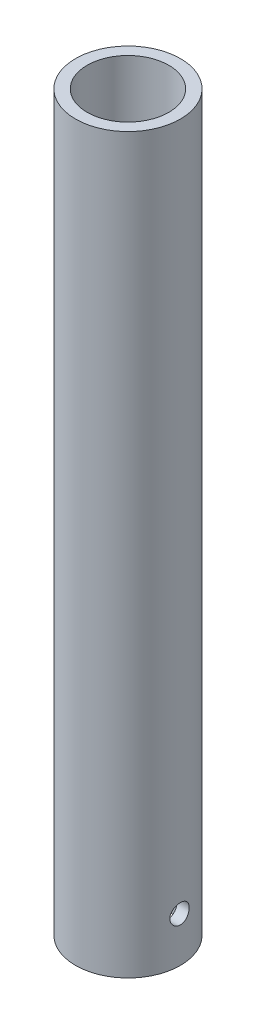
ISO-10303-21;
HEADER;
FILE_DESCRIPTION(('STEP AP214'),'2;1');
FILE_NAME('part.step','',(''),(''),'','','');
FILE_SCHEMA(('AUTOMOTIVE_DESIGN { 1 0 10303 214 1 1 1 1 }'));
ENDSEC;
DATA;
#1=APPLICATION_CONTEXT('core data for automotive mechanical design processes');
#2=APPLICATION_PROTOCOL_DEFINITION('international standard','automotive_design',2000,#1);
#3=PRODUCT_CONTEXT('',#1,'mechanical');
#4=PRODUCT('Part','Part','',(#3));
#5=PRODUCT_RELATED_PRODUCT_CATEGORY('part','',(#4));
#6=PRODUCT_DEFINITION_FORMATION('','',#4);
#7=PRODUCT_DEFINITION_CONTEXT('part definition',#1,'design');
#8=PRODUCT_DEFINITION('design','',#6,#7);
#9=PRODUCT_DEFINITION_SHAPE('','',#8);
#10=(LENGTH_UNIT() NAMED_UNIT(*) SI_UNIT(.MILLI.,.METRE.));
#11=(NAMED_UNIT(*) PLANE_ANGLE_UNIT() SI_UNIT($,.RADIAN.));
#12=(NAMED_UNIT(*) SI_UNIT($,.STERADIAN.) SOLID_ANGLE_UNIT());
#13=UNCERTAINTY_MEASURE_WITH_UNIT(LENGTH_MEASURE(1.E-05),#10,'distance_accuracy_value','');
#14=(GEOMETRIC_REPRESENTATION_CONTEXT(3) GLOBAL_UNCERTAINTY_ASSIGNED_CONTEXT((#13)) GLOBAL_UNIT_ASSIGNED_CONTEXT((#10,
#11,#12)) REPRESENTATION_CONTEXT('',''));
#15=CARTESIAN_POINT('',(0.,0.,0.));
#16=DIRECTION('',(0.,0.,1.));
#17=DIRECTION('',(1.,0.,0.));
#18=AXIS2_PLACEMENT_3D('',#15,#16,#17);
#19=CARTESIAN_POINT('',(0.,151.72,0.));
#20=DIRECTION('',(0.,1.,0.));
#21=DIRECTION('',(0.,0.,1.));
#22=AXIS2_PLACEMENT_3D('',#19,#20,#21);
#23=PLANE('',#22);
#24=CARTESIAN_POINT('',(0.,151.72,0.));
#25=DIRECTION('',(0.,1.,0.));
#26=DIRECTION('',(0.,0.,1.));
#27=AXIS2_PLACEMENT_3D('',#24,#25,#26);
#28=CIRCLE('',#27,10.85);
#29=CARTESIAN_POINT('',(0.,151.72,10.85));
#30=VERTEX_POINT('',#29);
#31=EDGE_CURVE('E10',#30,#30,#28,.T.);
#32=ORIENTED_EDGE('',*,*,#31,.T.);
#33=EDGE_LOOP('',(#32));
#34=FACE_BOUND('',#33,.T.);
#35=CARTESIAN_POINT('',(0.,151.72,0.));
#36=DIRECTION('',(0.,1.,0.));
#37=DIRECTION('',(0.,0.,1.));
#38=AXIS2_PLACEMENT_3D('',#35,#36,#37);
#39=CIRCLE('',#38,8.45);
#40=CARTESIAN_POINT('',(0.,151.72,8.45000000000001));
#41=VERTEX_POINT('',#40);
#42=EDGE_CURVE('E56',#41,#41,#39,.T.);
#43=ORIENTED_EDGE('',*,*,#42,.F.);
#44=EDGE_LOOP('',(#43));
#45=FACE_BOUND('',#44,.T.);
#46=ADVANCED_FACE('F34',(#34,#45),#23,.T.);
#47=CARTESIAN_POINT('',(0.,0.,0.));
#48=DIRECTION('',(0.,1.,0.));
#49=DIRECTION('',(0.,0.,1.));
#50=AXIS2_PLACEMENT_3D('',#47,#48,#49);
#51=PLANE('',#50);
#52=CARTESIAN_POINT('',(0.,0.,0.));
#53=DIRECTION('',(0.,1.,0.));
#54=DIRECTION('',(0.,0.,1.));
#55=AXIS2_PLACEMENT_3D('',#52,#53,#54);
#56=CIRCLE('',#55,10.85);
#57=CARTESIAN_POINT('',(0.,0.,10.85));
#58=VERTEX_POINT('',#57);
#59=EDGE_CURVE('E49',#58,#58,#56,.T.);
#60=ORIENTED_EDGE('',*,*,#59,.F.);
#61=EDGE_LOOP('',(#60));
#62=FACE_BOUND('',#61,.T.);
#63=CARTESIAN_POINT('',(0.,0.,0.));
#64=DIRECTION('',(0.,1.,0.));
#65=DIRECTION('',(0.,0.,1.));
#66=AXIS2_PLACEMENT_3D('',#63,#64,#65);
#67=CIRCLE('',#66,8.45);
#68=CARTESIAN_POINT('',(0.,0.,8.45000000000001));
#69=VERTEX_POINT('',#68);
#70=EDGE_CURVE('E59',#69,#69,#67,.T.);
#71=ORIENTED_EDGE('',*,*,#70,.T.);
#72=EDGE_LOOP('',(#71));
#73=FACE_BOUND('',#72,.T.);
#74=ADVANCED_FACE('F107',(#62,#73),#51,.F.);
#75=CARTESIAN_POINT('',(0.,151.72,0.));
#76=DIRECTION('',(0.,-1.,0.));
#77=DIRECTION('',(0.,0.,-1.));
#78=AXIS2_PLACEMENT_3D('',#75,#76,#77);
#79=CYLINDRICAL_SURFACE('',#78,10.85);
#80=CARTESIAN_POINT('',(-10.85,7.28,0.));
#81=CARTESIAN_POINT('',(-10.8499979966071,7.28000429014087,-0.111330237713952));
#82=CARTESIAN_POINT('',(-10.8482687684691,7.28932722775694,-0.222716692131425));
#83=CARTESIAN_POINT('',(-10.8415371818967,7.32634999873524,-0.442353143926067));
#84=CARTESIAN_POINT('',(-10.8365320216364,7.35406556315027,-0.550600373563324));
#85=CARTESIAN_POINT('',(-10.8238087013378,7.42699804570453,-0.760749986293585));
#86=CARTESIAN_POINT('',(-10.8160929554907,7.47219939368932,-0.862657920740687));
#87=CARTESIAN_POINT('',(-10.7987919375578,7.57877667632433,-1.05743349851401));
#88=CARTESIAN_POINT('',(-10.7892068266765,7.64015121644033,-1.15030192032765));
#89=CARTESIAN_POINT('',(-10.7691015375464,7.77808816806742,-1.32544878280122));
#90=CARTESIAN_POINT('',(-10.7585726847434,7.85480164143422,-1.40760727134947));
#91=CARTESIAN_POINT('',(-10.7378312779173,8.02091385125031,-1.55796462694323));
#92=CARTESIAN_POINT('',(-10.7276187461989,8.11031347976395,-1.62616251148334));
#93=CARTESIAN_POINT('',(-10.7085820287061,8.30010424973388,-1.74715881380481));
#94=CARTESIAN_POINT('',(-10.6997690319392,8.40057406050495,-1.79983574863052));
#95=CARTESIAN_POINT('',(-10.6846511739608,8.60912676630362,-1.88751729577165));
#96=CARTESIAN_POINT('',(-10.6783461040323,8.71720902691893,-1.92252337877316));
#97=CARTESIAN_POINT('',(-10.6690451529181,8.93663692623263,-1.97348566315497));
#98=CARTESIAN_POINT('',(-10.6660130169985,9.04793248824615,-1.9896507324599));
#99=CARTESIAN_POINT('',(-10.6634918841773,9.27169427952972,-2.00312032403724));
#100=CARTESIAN_POINT('',(-10.6640025803047,9.38416040653228,-2.00042648035225));
#101=CARTESIAN_POINT('',(-10.6684763859111,9.60556117155544,-1.97642420049726));
#102=CARTESIAN_POINT('',(-10.6723955292482,9.71452252723479,-1.95535280967121));
#103=CARTESIAN_POINT('',(-10.6831756202849,9.92733656796934,-1.89556667770517));
#104=CARTESIAN_POINT('',(-10.6900366891857,10.0311890423529,-1.85685120966242));
#105=CARTESIAN_POINT('',(-10.7059737673408,10.2315334653828,-1.76264274454816));
#106=CARTESIAN_POINT('',(-10.7150624107143,10.3279791560833,-1.70705360047875));
#107=CARTESIAN_POINT('',(-10.7344221587479,10.5102632127887,-1.58074379430912));
#108=CARTESIAN_POINT('',(-10.7446933794751,10.5961005358905,-1.51002164635492));
#109=CARTESIAN_POINT('',(-10.7654528075315,10.7561012499102,-1.35417317758374));
#110=CARTESIAN_POINT('',(-10.7759419380373,10.8300670723905,-1.26884400183011));
#111=CARTESIAN_POINT('',(-10.7958115245288,10.9626635761441,-1.08688360424585));
#112=CARTESIAN_POINT('',(-10.8051919700933,11.021294113279,-0.990252276196974));
#113=CARTESIAN_POINT('',(-10.8218052515382,11.1215830620547,-0.788227737721937));
#114=CARTESIAN_POINT('',(-10.8290355470758,11.1632214193481,-0.682824349956138));
#115=CARTESIAN_POINT('',(-10.8405141340358,11.2281469234557,-0.466356498469206));
#116=CARTESIAN_POINT('',(-10.8447627314514,11.2514359533775,-0.355292616904524));
#117=CARTESIAN_POINT('',(-10.8497573305719,11.2787278611626,-0.132356716032608));
#118=CARTESIAN_POINT('',(-10.8505525054138,11.283001519781,-0.0205189113177543));
#119=CARTESIAN_POINT('',(-10.8486863128133,11.2728670078927,0.202273442612423));
#120=CARTESIAN_POINT('',(-10.8460251092791,11.2584597232735,0.313228033460461));
#121=CARTESIAN_POINT('',(-10.8375757659389,11.2115974440297,0.530249067257712));
#122=CARTESIAN_POINT('',(-10.8318112930997,11.1792789939608,0.636345996498348));
#123=CARTESIAN_POINT('',(-10.8177990847865,11.0976591964105,0.841615602883251));
#124=CARTESIAN_POINT('',(-10.8095511851572,11.048356726248,0.940787821767655));
#125=CARTESIAN_POINT('',(-10.7913643850829,10.9335657740999,1.13055178694633));
#126=CARTESIAN_POINT('',(-10.7814084853757,10.8679112461564,1.22104142746274));
#127=CARTESIAN_POINT('',(-10.7609549762798,10.7225051456851,1.38981599730002));
#128=CARTESIAN_POINT('',(-10.7504573181786,10.6427523039301,1.46809982657467));
#129=CARTESIAN_POINT('',(-10.7299409616594,10.4701893447284,1.61126551848187));
#130=CARTESIAN_POINT('',(-10.719930120532,10.3772250626048,1.67596287248975));
#131=CARTESIAN_POINT('',(-10.7016771310991,10.1815888937768,1.78882323460131));
#132=CARTESIAN_POINT('',(-10.6934349184528,10.0789173604082,1.83698684422423));
#133=CARTESIAN_POINT('',(-10.6797136401145,9.86725711588392,1.91514863110321));
#134=CARTESIAN_POINT('',(-10.674221556278,9.75830094297544,1.94523252958497));
#135=CARTESIAN_POINT('',(-10.6665921476973,9.53677015146575,1.98664621813523));
#136=CARTESIAN_POINT('',(-10.6644544585646,9.42419592724999,1.9979780452515));
#137=CARTESIAN_POINT('',(-10.6637939232693,9.20047180962164,2.0014995484008));
#138=CARTESIAN_POINT('',(-10.6652161357828,9.08932655325165,1.99398015963117));
#139=CARTESIAN_POINT('',(-10.6713935554409,8.8699130223725,1.96064838329316));
#140=CARTESIAN_POINT('',(-10.676148744239,8.76164473203043,1.93483609641825));
#141=CARTESIAN_POINT('',(-10.6884335440639,8.55120798536769,1.86577223466991));
#142=CARTESIAN_POINT('',(-10.6959583037119,8.44902922367599,1.8225511418931));
#143=CARTESIAN_POINT('',(-10.7129380077987,8.25332676747094,1.71992803753564));
#144=CARTESIAN_POINT('',(-10.7223930822489,8.15980365655347,1.66052493596753));
#145=CARTESIAN_POINT('',(-10.742339199937,7.98260789325441,1.52620828726827));
#146=CARTESIAN_POINT('',(-10.7528432603442,7.89909746461232,1.4510826258397));
#147=CARTESIAN_POINT('',(-10.7736054181144,7.74577085518123,1.28789661602249));
#148=CARTESIAN_POINT('',(-10.7838634584008,7.67595782571319,1.1998332992356));
#149=CARTESIAN_POINT('',(-10.8030817768163,7.5514448304526,1.01235926139261));
#150=CARTESIAN_POINT('',(-10.8120300503164,7.4968809429623,0.912856898141448));
#151=CARTESIAN_POINT('',(-10.8275035155801,7.40533107782427,0.705965863966958));
#152=CARTESIAN_POINT('',(-10.8340310040783,7.36832842946854,0.598584784512844));
#153=CARTESIAN_POINT('',(-10.8425815787245,7.32054784332317,0.409059229963636));
#154=CARTESIAN_POINT('',(-10.8453479117638,7.30536812349246,0.328029311593736));
#155=CARTESIAN_POINT('',(-10.8490578415206,7.28509273600717,0.164676495206279));
#156=CARTESIAN_POINT('',(-10.8500014819575,7.27999682648063,0.0823536282493427));
#157=CARTESIAN_POINT('',(-10.85,7.28,0.));
#158=B_SPLINE_CURVE_WITH_KNOTS('',3,(#80,#81,#82,#83,#84,#85,#86,#87,#88,#89,#90,#91,#92,#93,
#94,#95,#96,#97,#98,#99,#100,#101,#102,#103,#104,#105,#106,#107,#108,#109,#110,#111,#112,#113,
#114,#115,#116,#117,#118,#119,#120,#121,#122,#123,#124,#125,#126,#127,#128,#129,#130,#131,#132,
#133,#134,#135,#136,#137,#138,#139,#140,#141,#142,#143,#144,#145,#146,#147,#148,#149,#150,#151,
#152,#153,#154,#155,#156,#157),.UNSPECIFIED.,.T.,.F.,(4,2,2,2,2,2,2,2,2,2,2,2,2,2,2,2,2,2,2,2,2,
2,2,2,2,2,2,2,2,2,2,2,2,2,2,2,2,2,4),(0.,0.333689564424345,0.667664899081648,1.00134352858348,
1.33499339603946,1.67210713695817,2.00924459477941,2.34895471397931,2.68863655557506,
3.02451581250134,3.36036596731428,3.69194713052482,4.02354195549024,4.35706286786356,
4.69061654246687,5.02924707002373,5.36788078030459,5.70691300176442,6.04591042536303,
6.380064716216,6.7142031613874,7.04582868350225,7.37747613099867,7.71263934498716,
8.04783274805276,8.38731961662486,8.72679413291139,9.06464613510149,9.4024614338339,
9.73509534408175,10.0677274233564,10.3997795921117,10.7318541327635,11.0687365858295,
11.4056964538156,11.7455736407525,12.0851275371212,12.3319715759047,12.5788096937743),.UNSPECIFIED.);
#159=CARTESIAN_POINT('',(-10.85,7.28,0.));
#160=VERTEX_POINT('',#159);
#161=EDGE_CURVE('E70',#160,#160,#158,.T.);
#162=ORIENTED_EDGE('',*,*,#161,.T.);
#163=EDGE_LOOP('',(#162));
#164=FACE_BOUND('',#163,.T.);
#165=CARTESIAN_POINT('',(10.6640752060364,9.28,-2.));
#166=CARTESIAN_POINT('',(10.6640773417752,9.16868787514926,-1.99999569531784));
#167=CARTESIAN_POINT('',(10.665836947721,9.05731949246498,-1.99067568851819));
#168=CARTESIAN_POINT('',(10.6726768633707,8.83772057026204,-1.95366561398047));
#169=CARTESIAN_POINT('',(10.6777600290373,8.72949281312049,-1.92595974681288));
#170=CARTESIAN_POINT('',(10.6906522398257,8.51938442741907,-1.85305561764876));
#171=CARTESIAN_POINT('',(10.6984587868341,8.41749808257137,-1.80787338232444));
#172=CARTESIAN_POINT('',(10.7159152036384,8.22275886184813,-1.70134114518312));
#173=CARTESIAN_POINT('',(10.7255649195179,8.1299052326597,-1.63999249320279));
#174=CARTESIAN_POINT('',(10.7457500863752,7.95474242402274,-1.50208201031393));
#175=CARTESIAN_POINT('',(10.7562939643004,7.87255770598945,-1.42536330848895));
#176=CARTESIAN_POINT('',(10.7770049305802,7.72214951055077,-1.2592295300043));
#177=CARTESIAN_POINT('',(10.7871719945587,7.65392693506837,-1.169813633766));
#178=CARTESIAN_POINT('',(10.806073889764,7.5329041998815,-0.980007860750698));
#179=CARTESIAN_POINT('',(10.8147976377749,7.48022115375081,-0.879542112603816));
#180=CARTESIAN_POINT('',(10.8297357304101,7.39252719740455,-0.670998205646433));
#181=CARTESIAN_POINT('',(10.8359502744191,7.35751488299388,-0.562920652481895));
#182=CARTESIAN_POINT('',(10.845110231829,7.30654047649984,-0.343510249680942));
#183=CARTESIAN_POINT('',(10.848091607339,7.29036867038193,-0.232227647853362));
#184=CARTESIAN_POINT('',(10.8505731974728,7.27688111065475,-0.00849146087402199));
#185=CARTESIAN_POINT('',(10.8500736990098,7.2795638029516,0.103962027003799));
#186=CARTESIAN_POINT('',(10.8456779823696,7.3035478201319,0.325410336768626));
#187=CARTESIAN_POINT('',(10.8418229581966,7.32462335407748,0.434430548642655));
#188=CARTESIAN_POINT('',(10.8311954959982,7.38443794036158,0.647360136341491));
#189=CARTESIAN_POINT('',(10.824422954306,7.42317762035521,0.75126933041258));
#190=CARTESIAN_POINT('',(10.8086523586324,7.5174374246326,0.951684845124722));
#191=CARTESIAN_POINT('',(10.7996423244636,7.5730482493404,1.04814752617146));
#192=CARTESIAN_POINT('',(10.7803939062936,7.69940498820727,1.23045649497745));
#193=CARTESIAN_POINT('',(10.7701554014519,7.77015239183696,1.31630173664592));
#194=CARTESIAN_POINT('',(10.7494057032939,7.92601957195865,1.47627621945631));
#195=CARTESIAN_POINT('',(10.7388927175699,8.01133685954928,1.55021291587639));
#196=CARTESIAN_POINT('',(10.7189242882562,8.19326282472387,1.68275620749519));
#197=CARTESIAN_POINT('',(10.7094688591346,8.28987165674679,1.74136259297961));
#198=CARTESIAN_POINT('',(10.6926837644054,8.49188851132399,1.841633796456));
#199=CARTESIAN_POINT('',(10.685357518873,8.59731034418757,1.88327140042991));
#200=CARTESIAN_POINT('',(10.673713269024,8.8138185155179,1.94818982261539));
#201=CARTESIAN_POINT('',(10.6693949361473,8.92490423388424,1.97147264579244));
#202=CARTESIAN_POINT('',(10.6643202357465,9.14785274706237,1.99874106810896));
#203=CARTESIAN_POINT('',(10.6635128748566,9.25968062374077,2.00300295157365));
#204=CARTESIAN_POINT('',(10.6654151744064,9.48245035748341,1.99284843527475));
#205=CARTESIAN_POINT('',(10.6681246670553,9.59339225656399,1.9784329266186));
#206=CARTESIAN_POINT('',(10.6767079434368,9.81033740565611,1.93156975949761));
#207=CARTESIAN_POINT('',(10.682556417516,9.91637288859206,1.89926626690185));
#208=CARTESIAN_POINT('',(10.6967369672058,10.1215261662516,1.81769679237324));
#209=CARTESIAN_POINT('',(10.7050692204888,10.2206434654703,1.76842959693611));
#210=CARTESIAN_POINT('',(10.7233949944004,10.4103659491921,1.65369277480466));
#211=CARTESIAN_POINT('',(10.7334060415588,10.5008636154974,1.5880482138445));
#212=CARTESIAN_POINT('',(10.753911803458,10.6696589700985,1.44265662669073));
#213=CARTESIAN_POINT('',(10.7644065601063,10.7479555987389,1.36290837687984));
#214=CARTESIAN_POINT('',(10.7848607052763,10.8911547966768,1.19034076567754));
#215=CARTESIAN_POINT('',(10.7948114539572,10.9558717988218,1.09736623334003));
#216=CARTESIAN_POINT('',(10.8129121459133,11.0687665897777,0.901703759523863));
#217=CARTESIAN_POINT('',(10.8210621568648,11.1169450001893,0.799016183293741));
#218=CARTESIAN_POINT('',(10.8346058693642,11.1951154487046,0.587361375815963));
#219=CARTESIAN_POINT('',(10.8400135037274,11.2251995641832,0.478429082007584));
#220=CARTESIAN_POINT('',(10.8475225226592,11.2666217559607,0.256949124796693));
#221=CARTESIAN_POINT('',(10.8496242429413,11.2779617357208,0.144401829679868));
#222=CARTESIAN_POINT('',(10.8502782588794,11.2815093096107,-0.0793319422289314));
#223=CARTESIAN_POINT('',(10.848882610425,11.2739974970242,-0.190513915379013));
#224=CARTESIAN_POINT('',(10.8428065715778,11.2406680473902,-0.410002888572744));
#225=CARTESIAN_POINT('',(10.8381262104305,11.2148505733273,-0.518309914204625));
#226=CARTESIAN_POINT('',(10.8260062472774,11.1457592693193,-0.728832760754707));
#227=CARTESIAN_POINT('',(10.8185712181185,11.1025143591608,-0.831058352497088));
#228=CARTESIAN_POINT('',(10.8017478422693,10.9998289708598,-1.02684469463771));
#229=CARTESIAN_POINT('',(10.7923593706313,10.9403874566615,-1.12040489021922));
#230=CARTESIAN_POINT('',(10.7725015912377,10.8060257023239,-1.29760535049923));
#231=CARTESIAN_POINT('',(10.7620191030939,10.7309022863825,-1.38109009837913));
#232=CARTESIAN_POINT('',(10.7412391644425,10.5677317003167,-1.53436593580373));
#233=CARTESIAN_POINT('',(10.7309417579826,10.4796814982746,-1.60415380381077));
#234=CARTESIAN_POINT('',(10.7115979991458,10.2922207929647,-1.72863621190333));
#235=CARTESIAN_POINT('',(10.7025635876253,10.1927162201729,-1.78319099805419));
#236=CARTESIAN_POINT('',(10.6869119382448,9.98582118904439,-1.87472325617031));
#237=CARTESIAN_POINT('',(10.6802923987436,9.87843835745927,-1.91171747549057));
#238=CARTESIAN_POINT('',(10.671614371372,9.68893463955589,-1.9594770125));
#239=CARTESIAN_POINT('',(10.6688038001562,9.60792970522735,-1.97464735940576));
#240=CARTESIAN_POINT('',(10.6650334513778,9.44462675021936,-1.99491031598051));
#241=CARTESIAN_POINT('',(10.6640736263996,9.36232876272211,-2.00000318383246));
#242=CARTESIAN_POINT('',(10.6640752060364,9.28,-2.));
#243=B_SPLINE_CURVE_WITH_KNOTS('',3,(#165,#166,#167,#168,#169,#170,#171,#172,#173,#174,#175,
#176,#177,#178,#179,#180,#181,#182,#183,#184,#185,#186,#187,#188,#189,#190,#191,#192,#193,#194,
#195,#196,#197,#198,#199,#200,#201,#202,#203,#204,#205,#206,#207,#208,#209,#210,#211,#212,#213,
#214,#215,#216,#217,#218,#219,#220,#221,#222,#223,#224,#225,#226,#227,#228,#229,#230,#231,#232,
#233,#234,#235,#236,#237,#238,#239,#240,#241,#242),.UNSPECIFIED.,.T.,.F.,(4,2,2,2,2,2,2,2,2,2,2,
2,2,2,2,2,2,2,2,2,2,2,2,2,2,2,2,2,2,2,2,2,2,2,2,2,2,2,4),(0.,0.333635127842299,
0.667557328592536,1.00117402983735,1.33476288412893,1.6719478761327,2.0091546426579,
2.34884138297385,2.68850112601571,3.02434285349316,3.36015689932973,3.69190556937845,
4.02366602827781,4.35724264725147,4.69085210596223,5.02940704168609,5.36796660850288,
5.7070670301597,6.0461304053983,6.38025241873202,6.71435849152932,7.04581026560321,
7.37728575512096,7.71246602353229,8.04767538601637,8.38720360878218,8.72671906902802,
9.06449187096214,9.40223037006695,9.7349718148099,10.0677102970215,10.3998988784876,
10.732108714211,11.0689244038656,11.4058192186577,11.7457102404282,12.0852764566692,
12.3320462587771,12.5788097386111),.UNSPECIFIED.);
#244=CARTESIAN_POINT('',(10.6640752060364,9.28,-2.));
#245=VERTEX_POINT('',#244);
#246=EDGE_CURVE('E166',#245,#245,#243,.T.);
#247=ORIENTED_EDGE('',*,*,#246,.T.);
#248=EDGE_LOOP('',(#247));
#249=FACE_BOUND('',#248,.T.);
#250=CARTESIAN_POINT('',(0.,11.28,-10.85));
#251=CARTESIAN_POINT('',(-0.111330237713948,11.2799957098591,-10.8499979966071));
#252=CARTESIAN_POINT('',(-0.222716692131422,11.2706727722431,-10.8482687684691));
#253=CARTESIAN_POINT('',(-0.442353143926063,11.2336500012648,-10.8415371818967));
#254=CARTESIAN_POINT('',(-0.550600373563317,11.2059344368497,-10.8365320216364));
#255=CARTESIAN_POINT('',(-0.760749986293581,11.1330019542955,-10.8238087013378));
#256=CARTESIAN_POINT('',(-0.862657920740688,11.0878006063107,-10.8160929554907));
#257=CARTESIAN_POINT('',(-1.05743349851401,10.9812233236757,-10.7987919375578));
#258=CARTESIAN_POINT('',(-1.15030192032765,10.9198487835597,-10.7892068266765));
#259=CARTESIAN_POINT('',(-1.32544878280121,10.7819118319326,-10.7691015375464));
#260=CARTESIAN_POINT('',(-1.40760727134947,10.7051983585658,-10.7585726847434));
#261=CARTESIAN_POINT('',(-1.55796462694323,10.5390861487497,-10.7378312779173));
#262=CARTESIAN_POINT('',(-1.62616251148334,10.4496865202361,-10.7276187461989));
#263=CARTESIAN_POINT('',(-1.7471588138048,10.2598957502661,-10.7085820287061));
#264=CARTESIAN_POINT('',(-1.79983574863052,10.159425939495,-10.6997690319392));
#265=CARTESIAN_POINT('',(-1.88751729577165,9.95087323369638,-10.6846511739608));
#266=CARTESIAN_POINT('',(-1.92252337877315,9.84279097308107,-10.6783461040323));
#267=CARTESIAN_POINT('',(-1.97348566315496,9.62336307376737,-10.6690451529181));
#268=CARTESIAN_POINT('',(-1.9896507324599,9.51206751175385,-10.6660130169985));
#269=CARTESIAN_POINT('',(-2.00312032403724,9.28830572047028,-10.6634918841773));
#270=CARTESIAN_POINT('',(-2.00042648035225,9.17583959346772,-10.6640025803047));
#271=CARTESIAN_POINT('',(-1.97642420049726,8.95443882844456,-10.6684763859111));
#272=CARTESIAN_POINT('',(-1.9553528096712,8.84547747276521,-10.6723955292482));
#273=CARTESIAN_POINT('',(-1.89556667770516,8.63266343203067,-10.6831756202849));
#274=CARTESIAN_POINT('',(-1.85685120966241,8.52881095764709,-10.6900366891857));
#275=CARTESIAN_POINT('',(-1.76264274454815,8.32846653461721,-10.7059737673408));
#276=CARTESIAN_POINT('',(-1.70705360047875,8.23202084391669,-10.7150624107143));
#277=CARTESIAN_POINT('',(-1.58074379430912,8.04973678721126,-10.7344221587479));
#278=CARTESIAN_POINT('',(-1.51002164635492,7.96389946410947,-10.7446933794751));
#279=CARTESIAN_POINT('',(-1.35417317758374,7.80389875008977,-10.7654528075315));
#280=CARTESIAN_POINT('',(-1.2688440018301,7.72993292760954,-10.7759419380373));
#281=CARTESIAN_POINT('',(-1.08688360424584,7.59733642385586,-10.7958115245288));
#282=CARTESIAN_POINT('',(-0.990252276196973,7.53870588672104,-10.8051919700933));
#283=CARTESIAN_POINT('',(-0.788227737721938,7.43841693794535,-10.8218052515382));
#284=CARTESIAN_POINT('',(-0.682824349956136,7.39677858065188,-10.8290355470758));
#285=CARTESIAN_POINT('',(-0.466356498469202,7.33185307654428,-10.8405141340358));
#286=CARTESIAN_POINT('',(-0.355292616904521,7.30856404662252,-10.8447627314514));
#287=CARTESIAN_POINT('',(-0.132356716032606,7.28127213883738,-10.8497573305719));
#288=CARTESIAN_POINT('',(-0.0205189113177515,7.27699848021903,-10.8505525054138));
#289=CARTESIAN_POINT('',(0.202273442612428,7.28713299210733,-10.8486863128133));
#290=CARTESIAN_POINT('',(0.313228033460468,7.30154027672649,-10.8460251092791));
#291=CARTESIAN_POINT('',(0.530249067257717,7.34840255597027,-10.8375757659389));
#292=CARTESIAN_POINT('',(0.63634599649835,7.38072100603917,-10.8318112930997));
#293=CARTESIAN_POINT('',(0.841615602883254,7.46234080358953,-10.8177990847866));
#294=CARTESIAN_POINT('',(0.940787821767662,7.51164327375195,-10.8095511851572));
#295=CARTESIAN_POINT('',(1.13055178694633,7.6264342259001,-10.7913643850829));
#296=CARTESIAN_POINT('',(1.22104142746273,7.69208875384356,-10.7814084853757));
#297=CARTESIAN_POINT('',(1.38981599730001,7.83749485431489,-10.7609549762798));
#298=CARTESIAN_POINT('',(1.46809982657467,7.91724769606985,-10.7504573181786));
#299=CARTESIAN_POINT('',(1.61126551848187,8.08981065527158,-10.7299409616594));
#300=CARTESIAN_POINT('',(1.67596287248975,8.18277493739516,-10.719930120532));
#301=CARTESIAN_POINT('',(1.78882323460131,8.37841110622323,-10.7016771310991));
#302=CARTESIAN_POINT('',(1.83698684422423,8.48108263959185,-10.6934349184528));
#303=CARTESIAN_POINT('',(1.91514863110321,8.69274288411608,-10.6797136401145));
#304=CARTESIAN_POINT('',(1.94523252958497,8.80169905702456,-10.674221556278));
#305=CARTESIAN_POINT('',(1.98664621813523,9.02322984853426,-10.6665921476973));
#306=CARTESIAN_POINT('',(1.9979780452515,9.13580407275001,-10.6644544585646));
#307=CARTESIAN_POINT('',(2.0014995484008,9.35952819037836,-10.6637939232693));
#308=CARTESIAN_POINT('',(1.99398015963117,9.47067344674835,-10.6652161357828));
#309=CARTESIAN_POINT('',(1.96064838329316,9.69008697762751,-10.6713935554409));
#310=CARTESIAN_POINT('',(1.93483609641825,9.79835526796957,-10.676148744239));
#311=CARTESIAN_POINT('',(1.86577223466991,10.0087920146323,-10.6884335440639));
#312=CARTESIAN_POINT('',(1.82255114189311,10.110970776324,-10.6959583037119));
#313=CARTESIAN_POINT('',(1.71992803753564,10.3066732325291,-10.7129380077987));
#314=CARTESIAN_POINT('',(1.66052493596754,10.4001963434465,-10.7223930822489));
#315=CARTESIAN_POINT('',(1.52620828726828,10.5773921067456,-10.742339199937));
#316=CARTESIAN_POINT('',(1.45108262583971,10.6609025353877,-10.7528432603442));
#317=CARTESIAN_POINT('',(1.2878966160225,10.8142291448188,-10.7736054181144));
#318=CARTESIAN_POINT('',(1.1998332992356,10.8840421742868,-10.7838634584008));
#319=CARTESIAN_POINT('',(1.01235926139262,11.0085551695474,-10.8030817768163));
#320=CARTESIAN_POINT('',(0.912856898141453,11.0631190570377,-10.8120300503164));
#321=CARTESIAN_POINT('',(0.705965863966965,11.1546689221757,-10.8275035155801));
#322=CARTESIAN_POINT('',(0.598584784512849,11.1916715705315,-10.8340310040783));
#323=CARTESIAN_POINT('',(0.409059229963639,11.2394521566768,-10.8425815787245));
#324=CARTESIAN_POINT('',(0.32802931159374,11.2546318765075,-10.8453479117638));
#325=CARTESIAN_POINT('',(0.164676495206283,11.2749072639928,-10.8490578415206));
#326=CARTESIAN_POINT('',(0.0823536282493466,11.2800031735194,-10.8500014819575));
#327=CARTESIAN_POINT('',(0.,11.28,-10.85));
#328=B_SPLINE_CURVE_WITH_KNOTS('',3,(#250,#251,#252,#253,#254,#255,#256,#257,#258,#259,#260,
#261,#262,#263,#264,#265,#266,#267,#268,#269,#270,#271,#272,#273,#274,#275,#276,#277,#278,#279,
#280,#281,#282,#283,#284,#285,#286,#287,#288,#289,#290,#291,#292,#293,#294,#295,#296,#297,#298,
#299,#300,#301,#302,#303,#304,#305,#306,#307,#308,#309,#310,#311,#312,#313,#314,#315,#316,#317,
#318,#319,#320,#321,#322,#323,#324,#325,#326,#327),.UNSPECIFIED.,.T.,.F.,(4,2,2,2,2,2,2,2,2,2,2,
2,2,2,2,2,2,2,2,2,2,2,2,2,2,2,2,2,2,2,2,2,2,2,2,2,2,2,4),(0.,0.333689564424345,
0.667664899081652,1.00134352858348,1.33499339603946,1.67210713695818,2.00924459477942,
2.34895471397931,2.68863655557506,3.02451581250134,3.36036596731428,3.69194713052482,
4.02354195549024,4.35706286786357,4.69061654246688,5.02924707002374,5.36788078030459,
5.70691300176442,6.04591042536302,6.380064716216,6.7142031613874,7.04582868350225,
7.37747613099867,7.71263934498715,8.04783274805276,8.38731961662485,8.72679413291138,
9.06464613510149,9.4024614338339,9.73509534408175,10.0677274233564,10.3997795921117,
10.7318541327635,11.0687365858295,11.4056964538156,11.7455736407525,12.0851275371212,
12.3319715759047,12.5788096937743),.UNSPECIFIED.);
#329=CARTESIAN_POINT('',(0.,11.28,-10.85));
#330=VERTEX_POINT('',#329);
#331=EDGE_CURVE('E69',#330,#330,#328,.T.);
#332=ORIENTED_EDGE('',*,*,#331,.T.);
#333=EDGE_LOOP('',(#332));
#334=FACE_BOUND('',#333,.T.);
#335=ORIENTED_EDGE('',*,*,#31,.F.);
#336=EDGE_LOOP('',(#335));
#337=FACE_BOUND('',#336,.T.);
#338=ORIENTED_EDGE('',*,*,#59,.T.);
#339=EDGE_LOOP('',(#338));
#340=FACE_BOUND('',#339,.T.);
#341=ADVANCED_FACE('F36',(#164,#249,#334,#337,#340),#79,.T.);
#342=CARTESIAN_POINT('',(0.,151.72,0.));
#343=DIRECTION('',(0.,-1.,0.));
#344=DIRECTION('',(0.,0.,-1.));
#345=AXIS2_PLACEMENT_3D('',#342,#343,#344);
#346=CYLINDRICAL_SURFACE('',#345,8.45);
#347=CARTESIAN_POINT('',(-8.20990255727801,9.28,-2.));
#348=CARTESIAN_POINT('',(-8.20990475552876,9.3906392686705,-1.99999654270131));
#349=CARTESIAN_POINT('',(-8.21216346976921,9.50131818668973,-1.99078795828261));
#350=CARTESIAN_POINT('',(-8.2209340954777,9.71951130914219,-1.95424745281454));
#351=CARTESIAN_POINT('',(-8.22744874475778,9.82702342983873,-1.92690386547743));
#352=CARTESIAN_POINT('',(-8.24395302470165,10.0356953597124,-1.85501678074259));
#353=CARTESIAN_POINT('',(-8.25393846661181,10.1368626532477,-1.81049400908132));
#354=CARTESIAN_POINT('',(-8.2762540934701,10.3302991312082,-1.70557395500154));
#355=CARTESIAN_POINT('',(-8.28858431368615,10.4225681817632,-1.64517643380502));
#356=CARTESIAN_POINT('',(-8.31447251620076,10.5974112559291,-1.50894863419256));
#357=CARTESIAN_POINT('',(-8.32804842616322,10.6797837990624,-1.43286312226816));
#358=CARTESIAN_POINT('',(-8.35474220892098,10.8307252032648,-1.26796945814503));
#359=CARTESIAN_POINT('',(-8.36786004211568,10.8992928733365,-1.17916020935293));
#360=CARTESIAN_POINT('',(-8.39235665911726,11.0214904724158,-0.989972602496738));
#361=CARTESIAN_POINT('',(-8.4037118186339,11.0749242832749,-0.889464247387046));
#362=CARTESIAN_POINT('',(-8.42320003020645,11.164065029396,-0.680579585902402));
#363=CARTESIAN_POINT('',(-8.43133350703418,11.1997743017568,-0.57220431899362));
#364=CARTESIAN_POINT('',(-8.4433352155671,11.2518120795093,-0.352760410083173));
#365=CARTESIAN_POINT('',(-8.44727854843723,11.2684822510737,-0.241776966646724));
#366=CARTESIAN_POINT('',(-8.45071670921209,11.2830392290785,-0.0185233875559222));
#367=CARTESIAN_POINT('',(-8.45021212921939,11.2809285356121,0.0937465748509437));
#368=CARTESIAN_POINT('',(-8.44486788094057,11.2582332898663,0.314022947885541));
#369=CARTESIAN_POINT('',(-8.4401147019018,11.2380172934474,0.422069742167662));
#370=CARTESIAN_POINT('',(-8.42690705371958,11.1802754511098,0.633191882982702));
#371=CARTESIAN_POINT('',(-8.41845239970871,11.1427487406154,0.736266980922459));
#372=CARTESIAN_POINT('',(-8.39865645384913,11.051140386438,0.935513705170813));
#373=CARTESIAN_POINT('',(-8.38729177126976,10.9969238403557,1.03162088765924));
#374=CARTESIAN_POINT('',(-8.36291454067668,10.8735763465834,1.21350461296647));
#375=CARTESIAN_POINT('',(-8.34990173309073,10.804443048363,1.29927952433846));
#376=CARTESIAN_POINT('',(-8.32327876587647,10.6512348731056,1.46025964173378));
#377=CARTESIAN_POINT('',(-8.30966177483238,10.5668376374688,1.53515722645916));
#378=CARTESIAN_POINT('',(-8.28365764841308,10.3865385294329,1.66979995324151));
#379=CARTESIAN_POINT('',(-8.27127055899037,10.2906362274682,1.72954452926995));
#380=CARTESIAN_POINT('',(-8.24910687683645,10.0894930666415,1.83235517841203));
#381=CARTESIAN_POINT('',(-8.23934081421249,9.98421673640873,1.87535427858571));
#382=CARTESIAN_POINT('',(-8.22366416635784,9.76764439706731,1.94295255044603));
#383=CARTESIAN_POINT('',(-8.21775285197594,9.6563495307204,1.96755520207221));
#384=CARTESIAN_POINT('',(-8.21060619884112,9.43373376882366,1.99716659497304));
#385=CARTESIAN_POINT('',(-8.20926306764168,9.32247635624226,2.00262711759685));
#386=CARTESIAN_POINT('',(-8.21111259868127,9.10064058688705,1.9950300749416));
#387=CARTESIAN_POINT('',(-8.21430489094246,8.99006217546261,1.98197402015522));
#388=CARTESIAN_POINT('',(-8.22476293719761,8.77435434593327,1.93810880258078));
#389=CARTESIAN_POINT('',(-8.2319697476439,8.66916959731486,1.90755635426513));
#390=CARTESIAN_POINT('',(-8.24959007190553,8.46541324509357,1.82984728028893));
#391=CARTESIAN_POINT('',(-8.26000393441957,8.36684236202794,1.78268884900093));
#392=CARTESIAN_POINT('',(-8.28309627694213,8.17717951448558,1.67213907230348));
#393=CARTESIAN_POINT('',(-8.29581173173946,8.08625169787724,1.608473998375));
#394=CARTESIAN_POINT('',(-8.32198090258961,7.91620416004907,1.46706952469958));
#395=CARTESIAN_POINT('',(-8.33543472663236,7.83708617239964,1.3893280623722));
#396=CARTESIAN_POINT('',(-8.36192566012557,7.69110795203079,1.21991684993756));
#397=CARTESIAN_POINT('',(-8.37494692311717,7.6245582865882,1.12797656973881));
#398=CARTESIAN_POINT('',(-8.39879483901961,7.50784595272677,0.933961184314762));
#399=CARTESIAN_POINT('',(-8.40962160230693,7.457682460057,0.831886589198763));
#400=CARTESIAN_POINT('',(-8.42779482934101,7.37557740203893,0.621182096530083));
#401=CARTESIAN_POINT('',(-8.4351651557949,7.34351057741099,0.512603162410048));
#402=CARTESIAN_POINT('',(-8.44569901204562,7.29812559961953,0.291402405068257));
#403=CARTESIAN_POINT('',(-8.4488632644506,7.28480422594381,0.178781279714721));
#404=CARTESIAN_POINT('',(-8.45060248324506,7.27745357453244,-0.0443762647573327));
#405=CARTESIAN_POINT('',(-8.44928702082578,7.28296370128216,-0.154896901670485));
#406=CARTESIAN_POINT('',(-8.44245396611759,7.31207557133977,-0.373389413104336));
#407=CARTESIAN_POINT('',(-8.43693647589609,7.33567687521242,-0.481361349467385));
#408=CARTESIAN_POINT('',(-8.42233244857856,7.40006518955059,-0.691264528620824));
#409=CARTESIAN_POINT('',(-8.41326159264742,7.44077674843229,-0.793220077807188));
#410=CARTESIAN_POINT('',(-8.39251167556695,7.53815984276251,-0.988909228092863));
#411=CARTESIAN_POINT('',(-8.38083231710483,7.59483319770242,-1.08264189026365));
#412=CARTESIAN_POINT('',(-8.35581306378754,7.72397874130253,-1.2614369508205));
#413=CARTESIAN_POINT('',(-8.34244250429426,7.79676858987874,-1.34626562079082));
#414=CARTESIAN_POINT('',(-8.31569716507395,7.9554534207161,-1.50266097763634));
#415=CARTESIAN_POINT('',(-8.30232238512103,8.04135163972934,-1.5742243793256));
#416=CARTESIAN_POINT('',(-8.27683766761389,8.22549554275692,-1.70319128701922));
#417=CARTESIAN_POINT('',(-8.26475182403847,8.32391923843477,-1.76034571494132));
#418=CARTESIAN_POINT('',(-8.24352741819897,8.52924638273883,-1.85721097842153));
#419=CARTESIAN_POINT('',(-8.23438655575116,8.63614313175291,-1.8969354365141));
#420=CARTESIAN_POINT('',(-8.2216326961836,8.832492423492,-1.95137298489481));
#421=CARTESIAN_POINT('',(-8.21726522280246,8.92094622009255,-1.96957054125578));
#422=CARTESIAN_POINT('',(-8.21139935376269,9.0995913016972,-1.99388505137517));
#423=CARTESIAN_POINT('',(-8.20990076477922,9.18978246921176,-2.00000281915232));
#424=CARTESIAN_POINT('',(-8.20990255727801,9.28,-2.));
#425=B_SPLINE_CURVE_WITH_KNOTS('',3,(#347,#348,#349,#350,#351,#352,#353,#354,#355,#356,#357,
#358,#359,#360,#361,#362,#363,#364,#365,#366,#367,#368,#369,#370,#371,#372,#373,#374,#375,#376,
#377,#378,#379,#380,#381,#382,#383,#384,#385,#386,#387,#388,#389,#390,#391,#392,#393,#394,#395,
#396,#397,#398,#399,#400,#401,#402,#403,#404,#405,#406,#407,#408,#409,#410,#411,#412,#413,#414,
#415,#416,#417,#418,#419,#420,#421,#422,#423,#424),.UNSPECIFIED.,.T.,.F.,(4,2,2,2,2,2,2,2,2,2,2,
2,2,2,2,2,2,2,2,2,2,2,2,2,2,2,2,2,2,2,2,2,2,2,2,2,2,2,4),(0.,0.331586805394917,
0.663387128490735,0.994788398172974,1.32619465287052,1.66349162589331,2.00081768631177,
2.34233362834736,2.68380452725107,3.01904621548658,3.35424327729389,3.68276828809476,
4.01130970870463,4.34257970726241,4.6739019443756,5.01327819436059,5.35266711960759,
5.69339981085515,6.03406803154258,6.36663977203837,6.69918438450293,7.02697039493995,
7.354792057724,7.68844273707593,8.02214234510738,8.3632384998256,8.70431749421357,
9.0430057466435,9.38163580453434,9.71204325953286,10.0424426891786,10.3714001857015,
10.7003951954052,11.0365667098591,11.3728213673521,11.714541847083,12.0559947745963,
12.3263956843474,12.5967783720149),.UNSPECIFIED.);
#426=CARTESIAN_POINT('',(-8.20990255727801,9.28,-2.));
#427=VERTEX_POINT('',#426);
#428=EDGE_CURVE('E39',#427,#427,#425,.T.);
#429=ORIENTED_EDGE('',*,*,#428,.F.);
#430=EDGE_LOOP('',(#429));
#431=FACE_BOUND('',#430,.T.);
#432=CARTESIAN_POINT('',(8.20990255727802,9.28,-2.));
#433=CARTESIAN_POINT('',(8.20990475552877,9.16936073132951,-1.99999654270131));
#434=CARTESIAN_POINT('',(8.21216346976922,9.05868181331028,-1.99078795828261));
#435=CARTESIAN_POINT('',(8.22093409547772,8.84048869085782,-1.95424745281454));
#436=CARTESIAN_POINT('',(8.22744874475779,8.73297657016127,-1.92690386547743));
#437=CARTESIAN_POINT('',(8.24395302470166,8.52430464028756,-1.85501678074259));
#438=CARTESIAN_POINT('',(8.25393846661182,8.4231373467523,-1.81049400908132));
#439=CARTESIAN_POINT('',(8.27625409347011,8.22970086879176,-1.70557395500154));
#440=CARTESIAN_POINT('',(8.28858431368616,8.1374318182368,-1.64517643380502));
#441=CARTESIAN_POINT('',(8.31447251620077,7.96258874407088,-1.50894863419256));
#442=CARTESIAN_POINT('',(8.32804842616324,7.88021620093757,-1.43286312226816));
#443=CARTESIAN_POINT('',(8.35474220892099,7.72927479673522,-1.26796945814503));
#444=CARTESIAN_POINT('',(8.36786004211569,7.66070712666346,-1.17916020935293));
#445=CARTESIAN_POINT('',(8.39235665911727,7.53850952758423,-0.989972602496739));
#446=CARTESIAN_POINT('',(8.40371181863392,7.48507571672506,-0.889464247387046));
#447=CARTESIAN_POINT('',(8.42320003020646,7.39593497060402,-0.680579585902403));
#448=CARTESIAN_POINT('',(8.43133350703419,7.36022569824317,-0.572204318993622));
#449=CARTESIAN_POINT('',(8.44333521556711,7.30818792049065,-0.352760410083176));
#450=CARTESIAN_POINT('',(8.44727854843725,7.2915177489263,-0.241776966646726));
#451=CARTESIAN_POINT('',(8.45071670921211,7.27696077092151,-0.0185233875559238));
#452=CARTESIAN_POINT('',(8.45021212921939,7.27907146438786,0.0937465748509421));
#453=CARTESIAN_POINT('',(8.44486788094057,7.3017667101337,0.314022947885538));
#454=CARTESIAN_POINT('',(8.44011470190181,7.32198270655263,0.422069742167658));
#455=CARTESIAN_POINT('',(8.42690705371959,7.37972454889022,0.633191882982698));
#456=CARTESIAN_POINT('',(8.41845239970871,7.41725125938462,0.736266980922457));
#457=CARTESIAN_POINT('',(8.39865645384913,7.50885961356196,0.935513705170813));
#458=CARTESIAN_POINT('',(8.38729177126978,7.56307615964426,1.03162088765924));
#459=CARTESIAN_POINT('',(8.36291454067669,7.68642365341663,1.21350461296647));
#460=CARTESIAN_POINT('',(8.34990173309074,7.75555695163703,1.29927952433846));
#461=CARTESIAN_POINT('',(8.32327876587648,7.90876512689444,1.46025964173378));
#462=CARTESIAN_POINT('',(8.3096617748324,7.99316236253123,1.53515722645916));
#463=CARTESIAN_POINT('',(8.28365764841309,8.17346147056715,1.66979995324151));
#464=CARTESIAN_POINT('',(8.27127055899038,8.2693637725318,1.72954452926996));
#465=CARTESIAN_POINT('',(8.24910687683646,8.47050693335853,1.83235517841204));
#466=CARTESIAN_POINT('',(8.23934081421251,8.57578326359127,1.87535427858571));
#467=CARTESIAN_POINT('',(8.22366416635785,8.79235560293269,1.94295255044602));
#468=CARTESIAN_POINT('',(8.21775285197595,8.9036504692796,1.96755520207221));
#469=CARTESIAN_POINT('',(8.21060619884113,9.12626623117633,1.99716659497304));
#470=CARTESIAN_POINT('',(8.20926306764169,9.23752364375774,2.00262711759685));
#471=CARTESIAN_POINT('',(8.21111259868128,9.45935941311295,1.9950300749416));
#472=CARTESIAN_POINT('',(8.21430489094247,9.56993782453739,1.98197402015522));
#473=CARTESIAN_POINT('',(8.22476293719762,9.78564565406673,1.93810880258078));
#474=CARTESIAN_POINT('',(8.23196974764391,9.89083040268514,1.90755635426513));
#475=CARTESIAN_POINT('',(8.24959007190554,10.0945867549064,1.82984728028893));
#476=CARTESIAN_POINT('',(8.26000393441957,10.1931576379721,1.78268884900093));
#477=CARTESIAN_POINT('',(8.28309627694214,10.3828204855144,1.67213907230348));
#478=CARTESIAN_POINT('',(8.29581173173947,10.4737483021228,1.60847399837501));
#479=CARTESIAN_POINT('',(8.32198090258962,10.6437958399509,1.46706952469958));
#480=CARTESIAN_POINT('',(8.33543472663236,10.7229138276004,1.38932806237219));
#481=CARTESIAN_POINT('',(8.36192566012557,10.8688920479692,1.21991684993756));
#482=CARTESIAN_POINT('',(8.37494692311719,10.9354417134118,1.12797656973881));
#483=CARTESIAN_POINT('',(8.39879483901963,11.0521540472732,0.933961184314767));
#484=CARTESIAN_POINT('',(8.40962160230694,11.102317539943,0.831886589198765));
#485=CARTESIAN_POINT('',(8.42779482934102,11.1844225979611,0.621182096530085));
#486=CARTESIAN_POINT('',(8.43516515579491,11.216489422589,0.512603162410052));
#487=CARTESIAN_POINT('',(8.44569901204563,11.2618744003805,0.291402405068262));
#488=CARTESIAN_POINT('',(8.4488632644506,11.2751957740562,0.178781279714725));
#489=CARTESIAN_POINT('',(8.45060248324507,11.2825464254676,-0.0443762647573319));
#490=CARTESIAN_POINT('',(8.4492870208258,11.2770362987178,-0.154896901670485));
#491=CARTESIAN_POINT('',(8.44245396611761,11.2479244286602,-0.373389413104337));
#492=CARTESIAN_POINT('',(8.43693647589609,11.2243231247876,-0.481361349467386));
#493=CARTESIAN_POINT('',(8.42233244857857,11.1599348104494,-0.691264528620826));
#494=CARTESIAN_POINT('',(8.41326159264743,11.1192232515677,-0.793220077807192));
#495=CARTESIAN_POINT('',(8.39251167556696,11.0218401572375,-0.988909228092866));
#496=CARTESIAN_POINT('',(8.38083231710484,10.9651668022976,-1.08264189026365));
#497=CARTESIAN_POINT('',(8.35581306378755,10.8360212586975,-1.2614369508205));
#498=CARTESIAN_POINT('',(8.34244250429427,10.7632314101213,-1.34626562079083));
#499=CARTESIAN_POINT('',(8.31569716507397,10.6045465792839,-1.50266097763634));
#500=CARTESIAN_POINT('',(8.30232238512104,10.5186483602707,-1.57422437932559));
#501=CARTESIAN_POINT('',(8.27683766761389,10.3345044572431,-1.70319128701922));
#502=CARTESIAN_POINT('',(8.26475182403848,10.2360807615652,-1.76034571494133));
#503=CARTESIAN_POINT('',(8.24352741819899,10.0307536172612,-1.85721097842154));
#504=CARTESIAN_POINT('',(8.23438655575117,9.92385686824709,-1.89693543651411));
#505=CARTESIAN_POINT('',(8.22163269618361,9.727507576508,-1.95137298489481));
#506=CARTESIAN_POINT('',(8.21726522280247,9.63905377990745,-1.96957054125578));
#507=CARTESIAN_POINT('',(8.2113993537627,9.46040869830281,-1.99388505137517));
#508=CARTESIAN_POINT('',(8.20990076477923,9.37021753078825,-2.00000281915232));
#509=CARTESIAN_POINT('',(8.20990255727802,9.28,-2.));
#510=B_SPLINE_CURVE_WITH_KNOTS('',3,(#432,#433,#434,#435,#436,#437,#438,#439,#440,#441,#442,
#443,#444,#445,#446,#447,#448,#449,#450,#451,#452,#453,#454,#455,#456,#457,#458,#459,#460,#461,
#462,#463,#464,#465,#466,#467,#468,#469,#470,#471,#472,#473,#474,#475,#476,#477,#478,#479,#480,
#481,#482,#483,#484,#485,#486,#487,#488,#489,#490,#491,#492,#493,#494,#495,#496,#497,#498,#499,
#500,#501,#502,#503,#504,#505,#506,#507,#508,#509),.UNSPECIFIED.,.T.,.F.,(4,2,2,2,2,2,2,2,2,2,2,
2,2,2,2,2,2,2,2,2,2,2,2,2,2,2,2,2,2,2,2,2,2,2,2,2,2,2,4),(0.,0.331586805394921,
0.663387128490742,0.994788398172978,1.32619465287052,1.66349162589331,2.00081768631178,
2.34233362834736,2.68380452725107,3.01904621548658,3.35424327729389,3.68276828809476,
4.01130970870463,4.34257970726241,4.67390194437561,5.0132781943606,5.35266711960759,
5.69339981085515,6.03406803154258,6.36663977203836,6.69918438450293,7.02697039493995,
7.354792057724,7.68844273707593,8.02214234510738,8.3632384998256,8.70431749421357,
9.0430057466435,9.38163580453434,9.71204325953287,10.0424426891787,10.3714001857015,
10.7003951954052,11.0365667098591,11.3728213673522,11.714541847083,12.0559947745963,
12.3263956843474,12.5967783720149),.UNSPECIFIED.);
#511=CARTESIAN_POINT('',(8.20990255727802,9.28,-2.));
#512=VERTEX_POINT('',#511);
#513=EDGE_CURVE('E71',#512,#512,#510,.T.);
#514=ORIENTED_EDGE('',*,*,#513,.F.);
#515=EDGE_LOOP('',(#514));
#516=FACE_BOUND('',#515,.T.);
#517=CARTESIAN_POINT('',(0.,11.28,-8.45000000000001));
#518=CARTESIAN_POINT('',(-0.110688231629405,11.2799965746053,-8.44999802583412));
#519=CARTESIAN_POINT('',(-0.221416039854577,11.2707801164866,-8.44780324726957));
#520=CARTESIAN_POINT('',(-0.439710615126907,11.2342055061423,-8.43926019127811));
#521=CARTESIAN_POINT('',(-0.54727534010438,11.2068358916941,-8.43290928963569));
#522=CARTESIAN_POINT('',(-0.756058787011379,11.1348727393869,-8.41675896092263));
#523=CARTESIAN_POINT('',(-0.857284546527111,11.090298710704,-8.40696344103772));
#524=CARTESIAN_POINT('',(-1.05081992661331,10.9852577629808,-8.38497323465039));
#525=CARTESIAN_POINT('',(-1.14312947651759,10.9247907179933,-8.37277852913533));
#526=CARTESIAN_POINT('',(-1.31793077204481,10.7884910319789,-8.34706551715662));
#527=CARTESIAN_POINT('',(-1.40023296266197,10.7124188007639,-8.33352851794879));
#528=CARTESIAN_POINT('',(-1.55103746135015,10.5475817334399,-8.30678406598888));
#529=CARTESIAN_POINT('',(-1.61953836291564,10.4588156052556,-8.29357664694473));
#530=CARTESIAN_POINT('',(-1.74166285858047,10.2696696793578,-8.26880021641224));
#531=CARTESIAN_POINT('',(-1.79507893491057,10.1691524916182,-8.25725503810893));
#532=CARTESIAN_POINT('',(-1.88418450499095,9.96024884046581,-8.23738107658849));
#533=CARTESIAN_POINT('',(-1.91987651288494,9.85186349564565,-8.22905183723052));
#534=CARTESIAN_POINT('',(-1.971882991498,9.63237251602903,-8.21674421947946));
#535=CARTESIAN_POINT('',(-1.98853603995754,9.52135145673515,-8.21268992282672));
#536=CARTESIAN_POINT('',(-2.00304571174026,9.29802302270447,-8.20916366245243));
#537=CARTESIAN_POINT('',(-2.00090505887443,9.18571583672497,-8.20969103469975));
#538=CARTESIAN_POINT('',(-1.97815925274109,8.96556316887439,-8.21520006430793));
#539=CARTESIAN_POINT('',(-1.95795300819667,8.8576736931119,-8.22008548579819));
#540=CARTESIAN_POINT('',(-1.90028402306839,8.6468610014961,-8.23360732261315));
#541=CARTESIAN_POINT('',(-1.86282016745945,8.54393810701149,-8.24224398030551));
#542=CARTESIAN_POINT('',(-1.77134798025592,8.34488778328383,-8.26238633499817));
#543=CARTESIAN_POINT('',(-1.71719110186065,8.24883131450606,-8.27391761214965));
#544=CARTESIAN_POINT('',(-1.59397430500666,8.06702438317624,-8.2985349416991));
#545=CARTESIAN_POINT('',(-1.52491203021003,7.9812755534609,-8.31162123977729));
#546=CARTESIAN_POINT('',(-1.37175853193205,7.82022714810011,-8.33828274741126));
#547=CARTESIAN_POINT('',(-1.28732950842879,7.74524910371382,-8.35186192304213));
#548=CARTESIAN_POINT('',(-1.10693676156687,7.61045861430468,-8.37767749172771));
#549=CARTESIAN_POINT('',(-1.01097275408722,7.55064654295149,-8.38991385169299));
#550=CARTESIAN_POINT('',(-0.809804686662708,7.44778503907341,-8.41171611441825));
#551=CARTESIAN_POINT('',(-0.704575326310001,7.40478336582184,-8.42127438710066));
#552=CARTESIAN_POINT('',(-0.488106194450708,7.33716598079439,-8.4365876006365));
#553=CARTESIAN_POINT('',(-0.376867453816038,7.31254712623215,-8.44234319158934));
#554=CARTESIAN_POINT('',(-0.154290160312638,7.28287491447009,-8.44930795063647));
#555=CARTESIAN_POINT('',(-0.0430131609732339,7.27738311908876,-8.45061897974633));
#556=CARTESIAN_POINT('',(0.178868928755073,7.28492464530051,-8.44883495257742));
#557=CARTESIAN_POINT('',(0.289474072270059,7.29795648249685,-8.44574024935328));
#558=CARTESIAN_POINT('',(0.505380458290076,7.34181287470793,-8.43555733184613));
#559=CARTESIAN_POINT('',(0.610732175179267,7.37240230285775,-8.42852192002017));
#560=CARTESIAN_POINT('',(0.814806323952147,7.4502403435978,-8.41124767434308));
#561=CARTESIAN_POINT('',(0.913528128093412,7.49749053104475,-8.40100853767047));
#562=CARTESIAN_POINT('',(1.10331492075363,7.60818648510389,-8.37821512767746));
#563=CARTESIAN_POINT('',(1.19422928960213,7.6718831251357,-8.36562591386544));
#564=CARTESIAN_POINT('',(1.36423531936223,7.81333902178669,-8.33959060227353));
#565=CARTESIAN_POINT('',(1.44332515974184,7.89110043978764,-8.32614437299915));
#566=CARTESIAN_POINT('',(1.58921198434341,8.06050461713023,-8.29955024557796));
#567=CARTESIAN_POINT('',(1.65570302453834,8.15241328296639,-8.28641526220782));
#568=CARTESIAN_POINT('',(1.77231244929156,8.34634682042099,-8.26226172172288));
#569=CARTESIAN_POINT('',(1.82243156625373,8.44837123924136,-8.25124306994232));
#570=CARTESIAN_POINT('',(1.90451245568647,8.65908315260923,-8.23268510804998));
#571=CARTESIAN_POINT('',(1.93658088225119,8.76772721393213,-8.22512541115884));
#572=CARTESIAN_POINT('',(1.98194712309462,8.98906778521201,-8.21431309256961));
#573=CARTESIAN_POINT('',(1.99524854339331,9.10176351238562,-8.21105964344727));
#574=CARTESIAN_POINT('',(2.00252982486028,9.32490832009404,-8.20928652440447));
#575=CARTESIAN_POINT('',(1.99699683083209,9.43534082549795,-8.21064750052216));
#576=CARTESIAN_POINT('',(1.96786985045706,9.65365085650536,-8.21767658437879));
#577=CARTESIAN_POINT('',(1.94427615704856,9.76152842351983,-8.22334462225867));
#578=CARTESIAN_POINT('',(1.87995046374432,9.97119959182572,-8.23828624723494));
#579=CARTESIAN_POINT('',(1.83930083554642,10.0730197838925,-8.24754248895028));
#580=CARTESIAN_POINT('',(1.74208411451382,10.2684632613293,-8.26862177061966));
#581=CARTESIAN_POINT('',(1.68551504788422,10.3620855283792,-8.28044512881983));
#582=CARTESIAN_POINT('',(1.5564991324397,10.5408507926043,-8.30567394186207));
#583=CARTESIAN_POINT('',(1.48371016026894,10.6257425943063,-8.31911006482756));
#584=CARTESIAN_POINT('',(1.32499930318913,10.7822656835419,-8.34585771624116));
#585=CARTESIAN_POINT('',(1.23907434787419,10.853893862157,-8.35916921478556));
#586=CARTESIAN_POINT('',(1.05489580951685,10.9829497434294,-8.38441769827435));
#587=CARTESIAN_POINT('',(0.956469187336616,11.0401357157943,-8.39632969934946));
#588=CARTESIAN_POINT('',(0.751131754404986,11.1370591987357,-8.41717972278259));
#589=CARTESIAN_POINT('',(0.644227563060767,11.1768101674595,-8.42612003770121));
#590=CARTESIAN_POINT('',(0.447812536482108,11.231306215196,-8.43857551848838));
#591=CARTESIAN_POINT('',(0.359297146720954,11.2495290162887,-8.44283157267992));
#592=CARTESIAN_POINT('',(0.180529877013275,11.2738769412911,-8.44854453421914));
#593=CARTESIAN_POINT('',(0.0902781019764174,11.2800027937761,-8.45000161014362));
#594=CARTESIAN_POINT('',(0.,11.28,-8.45000000000001));
#595=B_SPLINE_CURVE_WITH_KNOTS('',3,(#517,#518,#519,#520,#521,#522,#523,#524,#525,#526,#527,
#528,#529,#530,#531,#532,#533,#534,#535,#536,#537,#538,#539,#540,#541,#542,#543,#544,#545,#546,
#547,#548,#549,#550,#551,#552,#553,#554,#555,#556,#557,#558,#559,#560,#561,#562,#563,#564,#565,
#566,#567,#568,#569,#570,#571,#572,#573,#574,#575,#576,#577,#578,#579,#580,#581,#582,#583,#584,
#585,#586,#587,#588,#589,#590,#591,#592,#593,#594),.UNSPECIFIED.,.T.,.F.,(4,2,2,2,2,2,2,2,2,2,2,
2,2,2,2,2,2,2,2,2,2,2,2,2,2,2,2,2,2,2,2,2,2,2,2,2,2,2,4),(0.,0.331734031102818,
0.663677724576763,0.99524610671245,1.32681711650632,1.66392159568931,2.0010604122265,
2.34263332842323,2.68415777894836,3.01950937261575,3.35481236386766,3.68288949227114,
4.01098782091752,4.34209448536855,4.6732535316142,5.01284187238914,5.35243857936172,
5.69299320686896,6.03348959871266,6.36612769168722,6.69873913011317,7.02699691943822,
7.35528574562193,7.68891312291457,8.02259181347697,8.36355260761118,8.70449814665193,
9.04340744397579,9.38225161209407,9.71239900776031,10.0425410486623,10.3711066930062,
10.6997130930046,11.0360476040487,11.37246085049,11.714178830359,12.0556325705658,
12.3262134818319,12.5967780960469),.UNSPECIFIED.);
#596=CARTESIAN_POINT('',(0.,11.28,-8.45000000000001));
#597=VERTEX_POINT('',#596);
#598=EDGE_CURVE('E62',#597,#597,#595,.T.);
#599=ORIENTED_EDGE('',*,*,#598,.F.);
#600=EDGE_LOOP('',(#599));
#601=FACE_BOUND('',#600,.T.);
#602=ORIENTED_EDGE('',*,*,#42,.T.);
#603=EDGE_LOOP('',(#602));
#604=FACE_BOUND('',#603,.T.);
#605=ORIENTED_EDGE('',*,*,#70,.F.);
#606=EDGE_LOOP('',(#605));
#607=FACE_BOUND('',#606,.T.);
#608=ADVANCED_FACE('F75',(#431,#516,#601,#604,#607),#346,.F.);
#609=CARTESIAN_POINT('',(0.,9.28,-10.85));
#610=DIRECTION('',(0.,0.,1.));
#611=DIRECTION('',(1.,0.,0.));
#612=AXIS2_PLACEMENT_3D('',#609,#610,#611);
#613=CYLINDRICAL_SURFACE('',#612,2.);
#614=ORIENTED_EDGE('',*,*,#598,.T.);
#615=EDGE_LOOP('',(#614));
#616=FACE_BOUND('',#615,.T.);
#617=ORIENTED_EDGE('',*,*,#331,.F.);
#618=EDGE_LOOP('',(#617));
#619=FACE_BOUND('',#618,.T.);
#620=ADVANCED_FACE('F78',(#616,#619),#613,.F.);
#621=CARTESIAN_POINT('',(-10.85,9.28,0.));
#622=DIRECTION('',(1.,0.,0.));
#623=DIRECTION('',(0.,0.,-1.));
#624=AXIS2_PLACEMENT_3D('',#621,#622,#623);
#625=CYLINDRICAL_SURFACE('',#624,2.);
#626=ORIENTED_EDGE('',*,*,#513,.T.);
#627=EDGE_LOOP('',(#626));
#628=FACE_BOUND('',#627,.T.);
#629=ORIENTED_EDGE('',*,*,#246,.F.);
#630=EDGE_LOOP('',(#629));
#631=FACE_BOUND('',#630,.T.);
#632=ADVANCED_FACE('F81',(#628,#631),#625,.F.);
#633=ORIENTED_EDGE('',*,*,#428,.T.);
#634=EDGE_LOOP('',(#633));
#635=FACE_BOUND('',#634,.T.);
#636=ORIENTED_EDGE('',*,*,#161,.F.);
#637=EDGE_LOOP('',(#636));
#638=FACE_BOUND('',#637,.T.);
#639=ADVANCED_FACE('F83',(#635,#638),#625,.F.);
#640=CLOSED_SHELL('',(#46,#74,#341,#608,#620,#632,#639));
#641=MANIFOLD_SOLID_BREP('B2',#640);
#642=ADVANCED_BREP_SHAPE_REPRESENTATION('',(#18,#641),#14);
#643=SHAPE_DEFINITION_REPRESENTATION(#9,#642);
ENDSEC;
END-ISO-10303-21;
